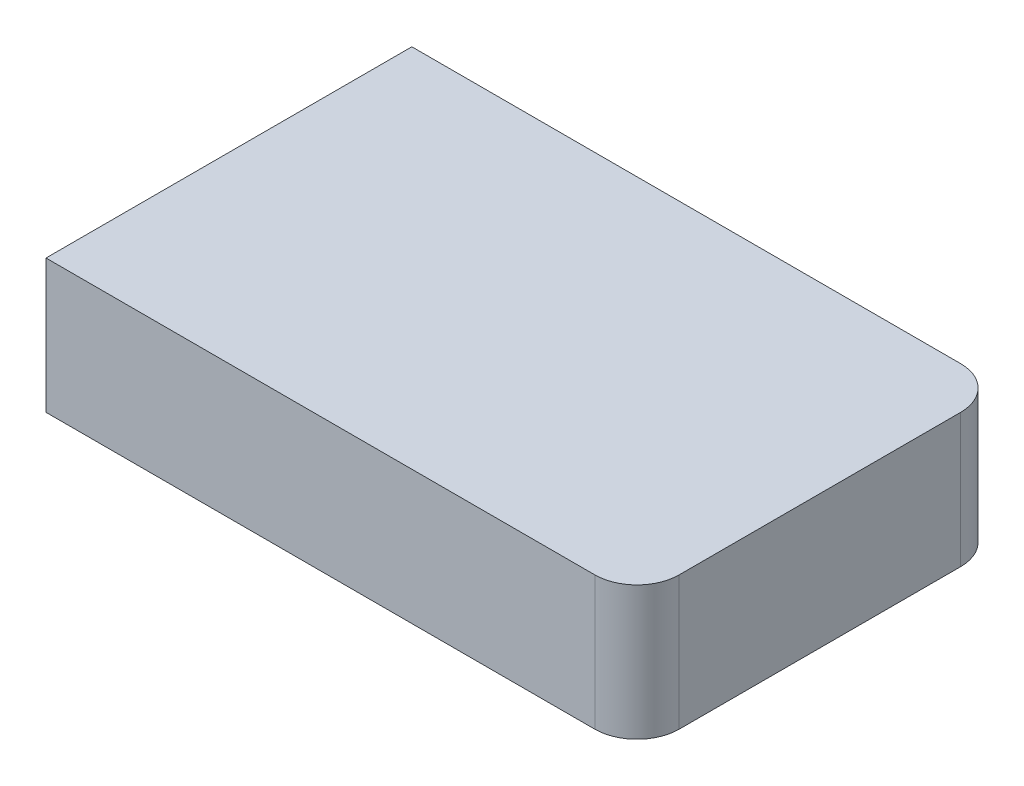
ISO-10303-21;
HEADER;
FILE_DESCRIPTION(('STEP AP214'),'2;1');
FILE_NAME('part.step','',(''),(''),'','','');
FILE_SCHEMA(('AUTOMOTIVE_DESIGN { 1 0 10303 214 1 1 1 1 }'));
ENDSEC;
DATA;
#1=APPLICATION_CONTEXT('core data for automotive mechanical design processes');
#2=APPLICATION_PROTOCOL_DEFINITION('international standard','automotive_design',2000,#1);
#3=PRODUCT_CONTEXT('',#1,'mechanical');
#4=PRODUCT('Part','Part','',(#3));
#5=PRODUCT_RELATED_PRODUCT_CATEGORY('part','',(#4));
#6=PRODUCT_DEFINITION_FORMATION('','',#4);
#7=PRODUCT_DEFINITION_CONTEXT('part definition',#1,'design');
#8=PRODUCT_DEFINITION('design','',#6,#7);
#9=PRODUCT_DEFINITION_SHAPE('','',#8);
#10=(LENGTH_UNIT() NAMED_UNIT(*) SI_UNIT(.MILLI.,.METRE.));
#11=(NAMED_UNIT(*) PLANE_ANGLE_UNIT() SI_UNIT($,.RADIAN.));
#12=(NAMED_UNIT(*) SI_UNIT($,.STERADIAN.) SOLID_ANGLE_UNIT());
#13=UNCERTAINTY_MEASURE_WITH_UNIT(LENGTH_MEASURE(1.E-05),#10,'distance_accuracy_value','');
#14=(GEOMETRIC_REPRESENTATION_CONTEXT(3) GLOBAL_UNCERTAINTY_ASSIGNED_CONTEXT((#13)) GLOBAL_UNIT_ASSIGNED_CONTEXT((#10,
#11,#12)) REPRESENTATION_CONTEXT('',''));
#15=CARTESIAN_POINT('',(0.,0.,0.));
#16=DIRECTION('',(0.,0.,1.));
#17=DIRECTION('',(1.,0.,0.));
#18=AXIS2_PLACEMENT_3D('',#15,#16,#17);
#19=CARTESIAN_POINT('',(21.,9.5,-13.));
#20=DIRECTION('',(-1.,0.,0.));
#21=DIRECTION('',(0.,0.,1.));
#22=AXIS2_PLACEMENT_3D('',#19,#20,#21);
#23=PLANE('',#22);
#24=DIRECTION('',(0.,0.,-1.));
#25=VECTOR('',#24,1.);
#26=CARTESIAN_POINT('',(21.,0.,-13.));
#27=LINE('',#26,#25);
#28=CARTESIAN_POINT('',(21.,0.,9.99999999999999));
#29=VERTEX_POINT('',#28);
#30=CARTESIAN_POINT('',(21.,0.,-10.));
#31=VERTEX_POINT('',#30);
#32=EDGE_CURVE('E118',#29,#31,#27,.T.);
#33=ORIENTED_EDGE('',*,*,#32,.T.);
#34=DIRECTION('',(0.,-1.,0.));
#35=VECTOR('',#34,1.);
#36=CARTESIAN_POINT('',(21.,9.5,-10.));
#37=LINE('',#36,#35);
#38=CARTESIAN_POINT('',(21.,9.5,-10.));
#39=VERTEX_POINT('',#38);
#40=EDGE_CURVE('E56',#31,#39,#37,.F.);
#41=ORIENTED_EDGE('',*,*,#40,.T.);
#42=DIRECTION('',(0.,0.,-1.));
#43=VECTOR('',#42,1.);
#44=CARTESIAN_POINT('',(21.,9.5,-13.));
#45=LINE('',#44,#43);
#46=CARTESIAN_POINT('',(21.,9.5,9.99999999999999));
#47=VERTEX_POINT('',#46);
#48=EDGE_CURVE('E99',#47,#39,#45,.T.);
#49=ORIENTED_EDGE('',*,*,#48,.F.);
#50=DIRECTION('',(0.,-1.,0.));
#51=VECTOR('',#50,1.);
#52=CARTESIAN_POINT('',(21.,9.5,10.));
#53=LINE('',#52,#51);
#54=EDGE_CURVE('E131',#47,#29,#53,.T.);
#55=ORIENTED_EDGE('',*,*,#54,.T.);
#56=EDGE_LOOP('',(#33,#41,#49,#55));
#57=FACE_BOUND('',#56,.T.);
#58=ADVANCED_FACE('F35',(#57),#23,.F.);
#59=CARTESIAN_POINT('',(-21.,9.5,-13.));
#60=DIRECTION('',(0.,0.,1.));
#61=DIRECTION('',(1.,0.,0.));
#62=AXIS2_PLACEMENT_3D('',#59,#60,#61);
#63=PLANE('',#62);
#64=DIRECTION('',(-1.,0.,0.));
#65=VECTOR('',#64,1.);
#66=CARTESIAN_POINT('',(-21.,9.5,-13.));
#67=LINE('',#66,#65);
#68=CARTESIAN_POINT('',(18.,9.5,-13.));
#69=VERTEX_POINT('',#68);
#70=CARTESIAN_POINT('',(-21.,9.5,-13.));
#71=VERTEX_POINT('',#70);
#72=EDGE_CURVE('E89',#69,#71,#67,.T.);
#73=ORIENTED_EDGE('',*,*,#72,.F.);
#74=DIRECTION('',(0.,-1.,0.));
#75=VECTOR('',#74,1.);
#76=CARTESIAN_POINT('',(18.,9.5,-13.));
#77=LINE('',#76,#75);
#78=CARTESIAN_POINT('',(18.,0.,-13.));
#79=VERTEX_POINT('',#78);
#80=EDGE_CURVE('E108',#69,#79,#77,.T.);
#81=ORIENTED_EDGE('',*,*,#80,.T.);
#82=DIRECTION('',(-1.,0.,0.));
#83=VECTOR('',#82,1.);
#84=CARTESIAN_POINT('',(-21.,0.,-13.));
#85=LINE('',#84,#83);
#86=CARTESIAN_POINT('',(-21.,0.,-13.));
#87=VERTEX_POINT('',#86);
#88=EDGE_CURVE('E105',#79,#87,#85,.T.);
#89=ORIENTED_EDGE('',*,*,#88,.T.);
#90=DIRECTION('',(0.,-1.,0.));
#91=VECTOR('',#90,1.);
#92=CARTESIAN_POINT('',(-21.,9.5,-13.));
#93=LINE('',#92,#91);
#94=EDGE_CURVE('E102',#71,#87,#93,.T.);
#95=ORIENTED_EDGE('',*,*,#94,.F.);
#96=EDGE_LOOP('',(#73,#81,#89,#95));
#97=FACE_BOUND('',#96,.T.);
#98=ADVANCED_FACE('F103',(#97),#63,.F.);
#99=CARTESIAN_POINT('',(-21.,9.5,-13.));
#100=DIRECTION('',(1.,0.,0.));
#101=DIRECTION('',(0.,0.,-1.));
#102=AXIS2_PLACEMENT_3D('',#99,#100,#101);
#103=PLANE('',#102);
#104=DIRECTION('',(0.,0.,1.));
#105=VECTOR('',#104,1.);
#106=CARTESIAN_POINT('',(-21.,0.,-13.));
#107=LINE('',#106,#105);
#108=CARTESIAN_POINT('',(-21.,0.,13.));
#109=VERTEX_POINT('',#108);
#110=EDGE_CURVE('E121',#87,#109,#107,.T.);
#111=ORIENTED_EDGE('',*,*,#110,.T.);
#112=DIRECTION('',(0.,-1.,0.));
#113=VECTOR('',#112,1.);
#114=CARTESIAN_POINT('',(-21.,9.5,13.));
#115=LINE('',#114,#113);
#116=CARTESIAN_POINT('',(-21.,9.5,13.));
#117=VERTEX_POINT('',#116);
#118=EDGE_CURVE('E109',#117,#109,#115,.T.);
#119=ORIENTED_EDGE('',*,*,#118,.F.);
#120=DIRECTION('',(0.,0.,1.));
#121=VECTOR('',#120,1.);
#122=CARTESIAN_POINT('',(-21.,9.5,-13.));
#123=LINE('',#122,#121);
#124=EDGE_CURVE('E93',#71,#117,#123,.T.);
#125=ORIENTED_EDGE('',*,*,#124,.F.);
#126=ORIENTED_EDGE('',*,*,#94,.T.);
#127=EDGE_LOOP('',(#111,#119,#125,#126));
#128=FACE_BOUND('',#127,.T.);
#129=ADVANCED_FACE('F111',(#128),#103,.F.);
#130=CARTESIAN_POINT('',(-21.,9.5,13.));
#131=DIRECTION('',(0.,0.,-1.));
#132=DIRECTION('',(-1.,0.,0.));
#133=AXIS2_PLACEMENT_3D('',#130,#131,#132);
#134=PLANE('',#133);
#135=DIRECTION('',(1.,0.,0.));
#136=VECTOR('',#135,1.);
#137=CARTESIAN_POINT('',(-21.,0.,13.));
#138=LINE('',#137,#136);
#139=CARTESIAN_POINT('',(18.,0.,13.));
#140=VERTEX_POINT('',#139);
#141=EDGE_CURVE('E123',#109,#140,#138,.T.);
#142=ORIENTED_EDGE('',*,*,#141,.T.);
#143=DIRECTION('',(0.,-1.,0.));
#144=VECTOR('',#143,1.);
#145=CARTESIAN_POINT('',(18.,9.5,13.));
#146=LINE('',#145,#144);
#147=CARTESIAN_POINT('',(18.,9.5,13.));
#148=VERTEX_POINT('',#147);
#149=EDGE_CURVE('E11',#140,#148,#146,.F.);
#150=ORIENTED_EDGE('',*,*,#149,.T.);
#151=DIRECTION('',(1.,0.,0.));
#152=VECTOR('',#151,1.);
#153=CARTESIAN_POINT('',(-21.,9.5,13.));
#154=LINE('',#153,#152);
#155=EDGE_CURVE('E113',#117,#148,#154,.T.);
#156=ORIENTED_EDGE('',*,*,#155,.F.);
#157=ORIENTED_EDGE('',*,*,#118,.T.);
#158=EDGE_LOOP('',(#142,#150,#156,#157));
#159=FACE_BOUND('',#158,.T.);
#160=ADVANCED_FACE('F143',(#159),#134,.F.);
#161=CARTESIAN_POINT('',(0.,9.5,0.));
#162=DIRECTION('',(0.,1.,0.));
#163=DIRECTION('',(0.,0.,1.));
#164=AXIS2_PLACEMENT_3D('',#161,#162,#163);
#165=PLANE('',#164);
#166=ORIENTED_EDGE('',*,*,#48,.T.);
#167=CARTESIAN_POINT('',(18.,9.5,-10.));
#168=DIRECTION('',(0.,1.,0.));
#169=DIRECTION('',(0.,0.,1.));
#170=AXIS2_PLACEMENT_3D('',#167,#168,#169);
#171=CIRCLE('',#170,3.);
#172=EDGE_CURVE('E43',#39,#69,#171,.T.);
#173=ORIENTED_EDGE('',*,*,#172,.T.);
#174=ORIENTED_EDGE('',*,*,#72,.T.);
#175=ORIENTED_EDGE('',*,*,#124,.T.);
#176=ORIENTED_EDGE('',*,*,#155,.T.);
#177=CARTESIAN_POINT('',(18.,9.5,10.));
#178=DIRECTION('',(0.,1.,0.));
#179=DIRECTION('',(0.,0.,1.));
#180=AXIS2_PLACEMENT_3D('',#177,#178,#179);
#181=CIRCLE('',#180,3.);
#182=EDGE_CURVE('E135',#148,#47,#181,.T.);
#183=ORIENTED_EDGE('',*,*,#182,.T.);
#184=EDGE_LOOP('',(#166,#173,#174,#175,#176,#183));
#185=FACE_BOUND('',#184,.T.);
#186=ADVANCED_FACE('F91',(#185),#165,.T.);
#187=CARTESIAN_POINT('',(0.,0.,0.));
#188=DIRECTION('',(0.,1.,0.));
#189=DIRECTION('',(0.,0.,1.));
#190=AXIS2_PLACEMENT_3D('',#187,#188,#189);
#191=PLANE('',#190);
#192=ORIENTED_EDGE('',*,*,#88,.F.);
#193=CARTESIAN_POINT('',(18.,0.,-10.));
#194=DIRECTION('',(0.,1.,0.));
#195=DIRECTION('',(0.,0.,1.));
#196=AXIS2_PLACEMENT_3D('',#193,#194,#195);
#197=CIRCLE('',#196,3.);
#198=EDGE_CURVE('E129',#79,#31,#197,.F.);
#199=ORIENTED_EDGE('',*,*,#198,.T.);
#200=ORIENTED_EDGE('',*,*,#32,.F.);
#201=CARTESIAN_POINT('',(18.,0.,10.));
#202=DIRECTION('',(0.,1.,0.));
#203=DIRECTION('',(0.,0.,1.));
#204=AXIS2_PLACEMENT_3D('',#201,#202,#203);
#205=CIRCLE('',#204,3.);
#206=EDGE_CURVE('E127',#29,#140,#205,.F.);
#207=ORIENTED_EDGE('',*,*,#206,.T.);
#208=ORIENTED_EDGE('',*,*,#141,.F.);
#209=ORIENTED_EDGE('',*,*,#110,.F.);
#210=EDGE_LOOP('',(#192,#199,#200,#207,#208,#209));
#211=FACE_BOUND('',#210,.T.);
#212=ADVANCED_FACE('F142',(#211),#191,.F.);
#213=CARTESIAN_POINT('',(18.,9.5,-10.));
#214=DIRECTION('',(0.,-1.,0.));
#215=DIRECTION('',(0.,0.,-1.));
#216=AXIS2_PLACEMENT_3D('',#213,#214,#215);
#217=CYLINDRICAL_SURFACE('',#216,3.);
#218=ORIENTED_EDGE('',*,*,#172,.F.);
#219=ORIENTED_EDGE('',*,*,#40,.F.);
#220=ORIENTED_EDGE('',*,*,#198,.F.);
#221=ORIENTED_EDGE('',*,*,#80,.F.);
#222=EDGE_LOOP('',(#218,#219,#220,#221));
#223=FACE_BOUND('',#222,.T.);
#224=ADVANCED_FACE('F159',(#223),#217,.T.);
#225=CARTESIAN_POINT('',(18.,9.5,10.));
#226=DIRECTION('',(0.,-1.,0.));
#227=DIRECTION('',(0.,0.,-1.));
#228=AXIS2_PLACEMENT_3D('',#225,#226,#227);
#229=CYLINDRICAL_SURFACE('',#228,3.);
#230=ORIENTED_EDGE('',*,*,#182,.F.);
#231=ORIENTED_EDGE('',*,*,#149,.F.);
#232=ORIENTED_EDGE('',*,*,#206,.F.);
#233=ORIENTED_EDGE('',*,*,#54,.F.);
#234=EDGE_LOOP('',(#230,#231,#232,#233));
#235=FACE_BOUND('',#234,.T.);
#236=ADVANCED_FACE('F37',(#235),#229,.T.);
#237=CLOSED_SHELL('',(#58,#98,#129,#160,#186,#212,#224,#236));
#238=MANIFOLD_SOLID_BREP('B2',#237);
#239=ADVANCED_BREP_SHAPE_REPRESENTATION('',(#18,#238),#14);
#240=SHAPE_DEFINITION_REPRESENTATION(#9,#239);
ENDSEC;
END-ISO-10303-21;
